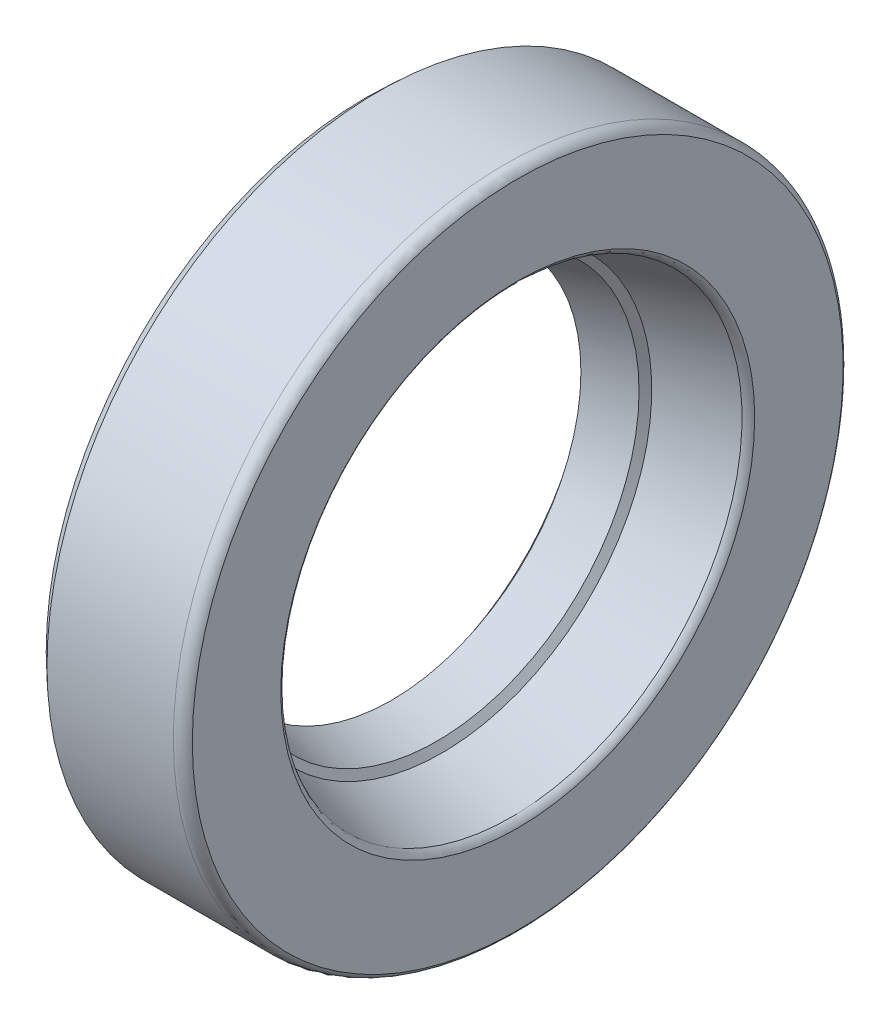
ISO-10303-21;
HEADER;
FILE_DESCRIPTION(('STEP AP214'),'2;1');
FILE_NAME('part.step','',(''),(''),'','','');
FILE_SCHEMA(('AUTOMOTIVE_DESIGN { 1 0 10303 214 1 1 1 1 }'));
ENDSEC;
DATA;
#1=APPLICATION_CONTEXT('core data for automotive mechanical design processes');
#2=APPLICATION_PROTOCOL_DEFINITION('international standard','automotive_design',2000,#1);
#3=PRODUCT_CONTEXT('',#1,'mechanical');
#4=PRODUCT('Part','Part','',(#3));
#5=PRODUCT_RELATED_PRODUCT_CATEGORY('part','',(#4));
#6=PRODUCT_DEFINITION_FORMATION('','',#4);
#7=PRODUCT_DEFINITION_CONTEXT('part definition',#1,'design');
#8=PRODUCT_DEFINITION('design','',#6,#7);
#9=PRODUCT_DEFINITION_SHAPE('','',#8);
#10=(LENGTH_UNIT() NAMED_UNIT(*) SI_UNIT(.MILLI.,.METRE.));
#11=(NAMED_UNIT(*) PLANE_ANGLE_UNIT() SI_UNIT($,.RADIAN.));
#12=(NAMED_UNIT(*) SI_UNIT($,.STERADIAN.) SOLID_ANGLE_UNIT());
#13=UNCERTAINTY_MEASURE_WITH_UNIT(LENGTH_MEASURE(1.E-05),#10,'distance_accuracy_value','');
#14=(GEOMETRIC_REPRESENTATION_CONTEXT(3) GLOBAL_UNCERTAINTY_ASSIGNED_CONTEXT((#13)) GLOBAL_UNIT_ASSIGNED_CONTEXT((#10,
#11,#12)) REPRESENTATION_CONTEXT('',''));
#15=CARTESIAN_POINT('',(0.,0.,0.));
#16=DIRECTION('',(0.,0.,1.));
#17=DIRECTION('',(1.,0.,0.));
#18=AXIS2_PLACEMENT_3D('',#15,#16,#17);
#19=CARTESIAN_POINT('',(0.,0.,0.));
#20=DIRECTION('',(-1.,0.,0.));
#21=DIRECTION('',(0.,0.,1.));
#22=AXIS2_PLACEMENT_3D('',#19,#20,#21);
#23=CYLINDRICAL_SURFACE('',#22,17.5);
#24=CARTESIAN_POINT('',(7.33333333333333,0.,0.));
#25=DIRECTION('',(-1.,0.,0.));
#26=DIRECTION('',(0.,0.,1.));
#27=AXIS2_PLACEMENT_3D('',#24,#25,#26);
#28=CIRCLE('',#27,17.5);
#29=CARTESIAN_POINT('',(7.33333333333333,0.,17.5));
#30=VERTEX_POINT('',#29);
#31=EDGE_CURVE('E10',#30,#30,#28,.T.);
#32=ORIENTED_EDGE('',*,*,#31,.T.);
#33=EDGE_LOOP('',(#32));
#34=FACE_BOUND('',#33,.T.);
#35=CARTESIAN_POINT('',(0.666666666666667,0.,0.));
#36=DIRECTION('',(-1.,0.,0.));
#37=DIRECTION('',(0.,0.,1.));
#38=AXIS2_PLACEMENT_3D('',#35,#36,#37);
#39=CIRCLE('',#38,17.5);
#40=CARTESIAN_POINT('',(0.666666666666667,0.,17.5));
#41=VERTEX_POINT('',#40);
#42=EDGE_CURVE('E70',#41,#41,#39,.T.);
#43=ORIENTED_EDGE('',*,*,#42,.F.);
#44=EDGE_LOOP('',(#43));
#45=FACE_BOUND('',#44,.T.);
#46=ADVANCED_FACE('F15',(#34,#45),#23,.T.);
#47=CARTESIAN_POINT('',(7.41946005043015,0.,0.));
#48=DIRECTION('',(-1.,0.,0.));
#49=DIRECTION('',(0.,0.,1.));
#50=AXIS2_PLACEMENT_3D('',#47,#48,#49);
#51=TOROIDAL_SURFACE('',#50,16.8389201008603,0.666666666666667);
#52=ORIENTED_EDGE('',*,*,#31,.F.);
#53=EDGE_LOOP('',(#52));
#54=FACE_BOUND('',#53,.T.);
#55=CARTESIAN_POINT('',(8.,0.,0.));
#56=DIRECTION('',(-1.,0.,0.));
#57=DIRECTION('',(0.,0.,1.));
#58=AXIS2_PLACEMENT_3D('',#55,#56,#57);
#59=CIRCLE('',#58,17.1666666666667);
#60=CARTESIAN_POINT('',(8.,0.,17.1666666666667));
#61=VERTEX_POINT('',#60);
#62=EDGE_CURVE('E21',#61,#61,#59,.T.);
#63=ORIENTED_EDGE('',*,*,#62,.T.);
#64=EDGE_LOOP('',(#63));
#65=FACE_BOUND('',#64,.T.);
#66=ADVANCED_FACE('F78',(#54,#65),#51,.T.);
#67=CARTESIAN_POINT('',(8.,17.1666666666667,0.));
#68=DIRECTION('',(1.,0.,0.));
#69=DIRECTION('',(0.,0.,-1.));
#70=AXIS2_PLACEMENT_3D('',#67,#68,#69);
#71=PLANE('',#70);
#72=CARTESIAN_POINT('',(8.,0.,0.));
#73=DIRECTION('',(-1.,0.,0.));
#74=DIRECTION('',(0.,0.,1.));
#75=AXIS2_PLACEMENT_3D('',#72,#73,#74);
#76=CIRCLE('',#75,12.5);
#77=CARTESIAN_POINT('',(8.,0.,12.5));
#78=VERTEX_POINT('',#77);
#79=EDGE_CURVE('E25',#78,#78,#76,.T.);
#80=ORIENTED_EDGE('',*,*,#79,.T.);
#81=EDGE_LOOP('',(#80));
#82=FACE_BOUND('',#81,.T.);
#83=ORIENTED_EDGE('',*,*,#62,.F.);
#84=EDGE_LOOP('',(#83));
#85=FACE_BOUND('',#84,.T.);
#86=ADVANCED_FACE('F83',(#82,#85),#71,.T.);
#87=CARTESIAN_POINT('',(7.39237478148924,0.,0.));
#88=DIRECTION('',(-1.,0.,0.));
#89=DIRECTION('',(0.,0.,1.));
#90=AXIS2_PLACEMENT_3D('',#87,#88,#89);
#91=TOROIDAL_SURFACE('',#90,12.7742918851774,0.666666666666667);
#92=ORIENTED_EDGE('',*,*,#79,.F.);
#93=EDGE_LOOP('',(#92));
#94=FACE_BOUND('',#93,.T.);
#95=CARTESIAN_POINT('',(7.66666666666667,0.,0.));
#96=DIRECTION('',(-1.,0.,0.));
#97=DIRECTION('',(0.,0.,1.));
#98=AXIS2_PLACEMENT_3D('',#95,#96,#97);
#99=CIRCLE('',#98,12.1666666666667);
#100=CARTESIAN_POINT('',(7.66666666666667,0.,12.1666666666667));
#101=VERTEX_POINT('',#100);
#102=EDGE_CURVE('E29',#101,#101,#99,.T.);
#103=ORIENTED_EDGE('',*,*,#102,.T.);
#104=EDGE_LOOP('',(#103));
#105=FACE_BOUND('',#104,.T.);
#106=ADVANCED_FACE('F88',(#94,#105),#91,.T.);
#107=CARTESIAN_POINT('',(7.66666666666667,0.,0.));
#108=DIRECTION('',(1.,0.,0.));
#109=DIRECTION('',(0.,0.,-1.));
#110=AXIS2_PLACEMENT_3D('',#107,#108,#109);
#111=CONICAL_SURFACE('',#110,12.1666666666667,0.290264899929044);
#112=CARTESIAN_POINT('',(4.,0.,0.));
#113=DIRECTION('',(-1.,0.,0.));
#114=DIRECTION('',(0.,0.,1.));
#115=AXIS2_PLACEMENT_3D('',#112,#113,#114);
#116=CIRCLE('',#115,11.0714285714286);
#117=CARTESIAN_POINT('',(4.,0.,11.0714285714286));
#118=VERTEX_POINT('',#117);
#119=EDGE_CURVE('E34',#118,#118,#116,.T.);
#120=ORIENTED_EDGE('',*,*,#119,.T.);
#121=EDGE_LOOP('',(#120));
#122=FACE_BOUND('',#121,.T.);
#123=ORIENTED_EDGE('',*,*,#102,.F.);
#124=EDGE_LOOP('',(#123));
#125=FACE_BOUND('',#124,.T.);
#126=ADVANCED_FACE('F94',(#122,#125),#111,.F.);
#127=CARTESIAN_POINT('',(4.,0.,0.));
#128=DIRECTION('',(1.,0.,0.));
#129=DIRECTION('',(0.,0.,-1.));
#130=AXIS2_PLACEMENT_3D('',#127,#128,#129);
#131=CONICAL_SURFACE('',#130,11.0714285714286,0.988243260581542);
#132=CARTESIAN_POINT('',(3.73333333333334,0.,0.));
#133=DIRECTION('',(-1.,0.,0.));
#134=DIRECTION('',(0.,0.,1.));
#135=AXIS2_PLACEMENT_3D('',#132,#133,#134);
#136=CIRCLE('',#135,10.6666666666667);
#137=CARTESIAN_POINT('',(3.73333333333334,0.,10.6666666666667));
#138=VERTEX_POINT('',#137);
#139=EDGE_CURVE('E37',#138,#138,#136,.T.);
#140=ORIENTED_EDGE('',*,*,#139,.T.);
#141=EDGE_LOOP('',(#140));
#142=FACE_BOUND('',#141,.T.);
#143=ORIENTED_EDGE('',*,*,#119,.F.);
#144=EDGE_LOOP('',(#143));
#145=FACE_BOUND('',#144,.T.);
#146=ADVANCED_FACE('F98',(#142,#145),#131,.F.);
#147=CARTESIAN_POINT('',(3.73333333333334,0.,0.));
#148=DIRECTION('',(1.,0.,0.));
#149=DIRECTION('',(0.,0.,-1.));
#150=AXIS2_PLACEMENT_3D('',#147,#148,#149);
#151=CONICAL_SURFACE('',#150,10.6666666666667,0.27094685033842);
#152=CARTESIAN_POINT('',(1.33333333333333,0.,0.));
#153=DIRECTION('',(-1.,0.,0.));
#154=DIRECTION('',(0.,0.,1.));
#155=AXIS2_PLACEMENT_3D('',#152,#153,#154);
#156=CIRCLE('',#155,10.);
#157=CARTESIAN_POINT('',(1.33333333333333,0.,10.));
#158=VERTEX_POINT('',#157);
#159=EDGE_CURVE('E40',#158,#158,#156,.T.);
#160=ORIENTED_EDGE('',*,*,#159,.T.);
#161=EDGE_LOOP('',(#160));
#162=FACE_BOUND('',#161,.T.);
#163=ORIENTED_EDGE('',*,*,#139,.F.);
#164=EDGE_LOOP('',(#163));
#165=FACE_BOUND('',#164,.T.);
#166=ADVANCED_FACE('F102',(#162,#165),#151,.F.);
#167=CARTESIAN_POINT('',(1.33333333333333,0.,0.));
#168=DIRECTION('',(-1.,0.,0.));
#169=DIRECTION('',(0.,0.,1.));
#170=AXIS2_PLACEMENT_3D('',#167,#168,#169);
#171=CONICAL_SURFACE('',#170,10.,0.929431966886443);
#172=CARTESIAN_POINT('',(0.533333333333334,0.,0.));
#173=DIRECTION('',(-1.,0.,0.));
#174=DIRECTION('',(0.,0.,1.));
#175=AXIS2_PLACEMENT_3D('',#172,#173,#174);
#176=CIRCLE('',#175,11.0714285714286);
#177=CARTESIAN_POINT('',(0.533333333333334,0.,11.0714285714286));
#178=VERTEX_POINT('',#177);
#179=EDGE_CURVE('E43',#178,#178,#176,.T.);
#180=ORIENTED_EDGE('',*,*,#179,.T.);
#181=EDGE_LOOP('',(#180));
#182=FACE_BOUND('',#181,.T.);
#183=ORIENTED_EDGE('',*,*,#159,.F.);
#184=EDGE_LOOP('',(#183));
#185=FACE_BOUND('',#184,.T.);
#186=ADVANCED_FACE('F106',(#182,#185),#171,.F.);
#187=CARTESIAN_POINT('',(0.533333333333333,11.0714285714286,0.));
#188=DIRECTION('',(-1.,0.,0.));
#189=DIRECTION('',(0.,0.,1.));
#190=AXIS2_PLACEMENT_3D('',#187,#188,#189);
#191=PLANE('',#190);
#192=CARTESIAN_POINT('',(0.533333333333334,0.,0.));
#193=DIRECTION('',(-1.,0.,0.));
#194=DIRECTION('',(0.,0.,1.));
#195=AXIS2_PLACEMENT_3D('',#192,#193,#194);
#196=CIRCLE('',#195,12.7464212528967);
#197=CARTESIAN_POINT('',(0.533333333333334,0.,12.7464212528967));
#198=VERTEX_POINT('',#197);
#199=EDGE_CURVE('E46',#198,#198,#196,.T.);
#200=ORIENTED_EDGE('',*,*,#199,.T.);
#201=EDGE_LOOP('',(#200));
#202=FACE_BOUND('',#201,.T.);
#203=ORIENTED_EDGE('',*,*,#179,.F.);
#204=EDGE_LOOP('',(#203));
#205=FACE_BOUND('',#204,.T.);
#206=ADVANCED_FACE('F110',(#202,#205),#191,.T.);
#207=CARTESIAN_POINT('',(0.,0.,0.));
#208=DIRECTION('',(-1.,0.,0.));
#209=DIRECTION('',(0.,0.,1.));
#210=AXIS2_PLACEMENT_3D('',#207,#208,#209);
#211=CYLINDRICAL_SURFACE('',#210,12.7464212528967);
#212=CARTESIAN_POINT('',(1.57795142459664,0.,0.));
#213=DIRECTION('',(-1.,0.,0.));
#214=DIRECTION('',(0.,0.,1.));
#215=AXIS2_PLACEMENT_3D('',#212,#213,#214);
#216=CIRCLE('',#215,12.7464212528967);
#217=CARTESIAN_POINT('',(1.57795142459664,0.,12.7464212528967));
#218=VERTEX_POINT('',#217);
#219=EDGE_CURVE('E49',#218,#218,#216,.T.);
#220=ORIENTED_EDGE('',*,*,#219,.T.);
#221=EDGE_LOOP('',(#220));
#222=FACE_BOUND('',#221,.T.);
#223=ORIENTED_EDGE('',*,*,#199,.F.);
#224=EDGE_LOOP('',(#223));
#225=FACE_BOUND('',#224,.T.);
#226=ADVANCED_FACE('F114',(#222,#225),#211,.T.);
#227=CARTESIAN_POINT('',(2.,0.,0.));
#228=DIRECTION('',(-1.,0.,0.));
#229=DIRECTION('',(0.,0.,1.));
#230=AXIS2_PLACEMENT_3D('',#227,#228,#229);
#231=TOROIDAL_SURFACE('',#230,11.875,0.968245836551854);
#232=ORIENTED_EDGE('',*,*,#219,.F.);
#233=EDGE_LOOP('',(#232));
#234=FACE_BOUND('',#233,.T.);
#235=CARTESIAN_POINT('',(2.9449901071866,0.,0.));
#236=DIRECTION('',(-1.,0.,0.));
#237=DIRECTION('',(0.,0.,1.));
#238=AXIS2_PLACEMENT_3D('',#235,#236,#237);
#239=CIRCLE('',#238,12.0859352917827);
#240=CARTESIAN_POINT('',(2.9449901071866,0.,12.0859352917827));
#241=VERTEX_POINT('',#240);
#242=EDGE_CURVE('E52',#241,#241,#239,.T.);
#243=ORIENTED_EDGE('',*,*,#242,.T.);
#244=EDGE_LOOP('',(#243));
#245=FACE_BOUND('',#244,.T.);
#246=ADVANCED_FACE('F118',(#234,#245),#231,.T.);
#247=CARTESIAN_POINT('',(4.8,0.,0.));
#248=DIRECTION('',(1.,0.,0.));
#249=DIRECTION('',(0.,0.,-1.));
#250=AXIS2_PLACEMENT_3D('',#247,#248,#249);
#251=CONICAL_SURFACE('',#250,12.5,0.2196141251766);
#252=ORIENTED_EDGE('',*,*,#242,.F.);
#253=EDGE_LOOP('',(#252));
#254=FACE_BOUND('',#253,.T.);
#255=CARTESIAN_POINT('',(4.8,0.,0.));
#256=DIRECTION('',(-1.,0.,0.));
#257=DIRECTION('',(0.,0.,1.));
#258=AXIS2_PLACEMENT_3D('',#255,#256,#257);
#259=CIRCLE('',#258,12.5);
#260=CARTESIAN_POINT('',(4.8,0.,12.5));
#261=VERTEX_POINT('',#260);
#262=EDGE_CURVE('E55',#261,#261,#259,.T.);
#263=ORIENTED_EDGE('',*,*,#262,.T.);
#264=EDGE_LOOP('',(#263));
#265=FACE_BOUND('',#264,.T.);
#266=ADVANCED_FACE('F122',(#254,#265),#251,.T.);
#267=CARTESIAN_POINT('',(4.8,15.2916666666667,0.));
#268=DIRECTION('',(1.,0.,0.));
#269=DIRECTION('',(0.,0.,-1.));
#270=AXIS2_PLACEMENT_3D('',#267,#268,#269);
#271=PLANE('',#270);
#272=ORIENTED_EDGE('',*,*,#262,.F.);
#273=EDGE_LOOP('',(#272));
#274=FACE_BOUND('',#273,.T.);
#275=CARTESIAN_POINT('',(4.8,0.,0.));
#276=DIRECTION('',(-1.,0.,0.));
#277=DIRECTION('',(0.,0.,1.));
#278=AXIS2_PLACEMENT_3D('',#275,#276,#277);
#279=CIRCLE('',#278,15.2916666666667);
#280=CARTESIAN_POINT('',(4.8,0.,15.2916666666667));
#281=VERTEX_POINT('',#280);
#282=EDGE_CURVE('E58',#281,#281,#279,.T.);
#283=ORIENTED_EDGE('',*,*,#282,.T.);
#284=EDGE_LOOP('',(#283));
#285=FACE_BOUND('',#284,.T.);
#286=ADVANCED_FACE('F126',(#274,#285),#271,.F.);
#287=CARTESIAN_POINT('',(4.19237478148924,0.,0.));
#288=DIRECTION('',(-1.,0.,0.));
#289=DIRECTION('',(0.,0.,1.));
#290=AXIS2_PLACEMENT_3D('',#287,#288,#289);
#291=TOROIDAL_SURFACE('',#290,15.0173747814893,0.666666666666667);
#292=CARTESIAN_POINT('',(4.46666666666667,0.,0.));
#293=DIRECTION('',(-1.,0.,0.));
#294=DIRECTION('',(0.,0.,1.));
#295=AXIS2_PLACEMENT_3D('',#292,#293,#294);
#296=CIRCLE('',#295,15.625);
#297=CARTESIAN_POINT('',(4.46666666666667,0.,15.625));
#298=VERTEX_POINT('',#297);
#299=EDGE_CURVE('E61',#298,#298,#296,.T.);
#300=ORIENTED_EDGE('',*,*,#299,.T.);
#301=EDGE_LOOP('',(#300));
#302=FACE_BOUND('',#301,.T.);
#303=ORIENTED_EDGE('',*,*,#282,.F.);
#304=EDGE_LOOP('',(#303));
#305=FACE_BOUND('',#304,.T.);
#306=ADVANCED_FACE('F130',(#302,#305),#291,.F.);
#307=CARTESIAN_POINT('',(0.,0.,0.));
#308=DIRECTION('',(-1.,0.,0.));
#309=DIRECTION('',(0.,0.,1.));
#310=AXIS2_PLACEMENT_3D('',#307,#308,#309);
#311=CONICAL_SURFACE('',#310,16.,0.0837588016725198);
#312=ORIENTED_EDGE('',*,*,#299,.F.);
#313=EDGE_LOOP('',(#312));
#314=FACE_BOUND('',#313,.T.);
#315=CARTESIAN_POINT('',(0.,0.,0.));
#316=DIRECTION('',(-1.,0.,0.));
#317=DIRECTION('',(0.,0.,1.));
#318=AXIS2_PLACEMENT_3D('',#315,#316,#317);
#319=CIRCLE('',#318,16.);
#320=CARTESIAN_POINT('',(0.,0.,16.));
#321=VERTEX_POINT('',#320);
#322=EDGE_CURVE('E64',#321,#321,#319,.T.);
#323=ORIENTED_EDGE('',*,*,#322,.T.);
#324=EDGE_LOOP('',(#323));
#325=FACE_BOUND('',#324,.T.);
#326=ADVANCED_FACE('F134',(#314,#325),#311,.F.);
#327=CARTESIAN_POINT('',(0.,16.,0.));
#328=DIRECTION('',(-1.,0.,0.));
#329=DIRECTION('',(0.,0.,1.));
#330=AXIS2_PLACEMENT_3D('',#327,#328,#329);
#331=PLANE('',#330);
#332=CARTESIAN_POINT('',(0.,0.,0.));
#333=DIRECTION('',(-1.,0.,0.));
#334=DIRECTION('',(0.,0.,1.));
#335=AXIS2_PLACEMENT_3D('',#332,#333,#334);
#336=CIRCLE('',#335,16.875);
#337=CARTESIAN_POINT('',(0.,0.,16.875));
#338=VERTEX_POINT('',#337);
#339=EDGE_CURVE('E67',#338,#338,#336,.T.);
#340=ORIENTED_EDGE('',*,*,#339,.T.);
#341=EDGE_LOOP('',(#340));
#342=FACE_BOUND('',#341,.T.);
#343=ORIENTED_EDGE('',*,*,#322,.F.);
#344=EDGE_LOOP('',(#343));
#345=FACE_BOUND('',#344,.T.);
#346=ADVANCED_FACE('F138',(#342,#345),#331,.T.);
#347=CARTESIAN_POINT('',(0.,0.,0.));
#348=DIRECTION('',(1.,0.,0.));
#349=DIRECTION('',(0.,0.,-1.));
#350=AXIS2_PLACEMENT_3D('',#347,#348,#349);
#351=CONICAL_SURFACE('',#350,16.875,0.753151280962195);
#352=ORIENTED_EDGE('',*,*,#42,.T.);
#353=EDGE_LOOP('',(#352));
#354=FACE_BOUND('',#353,.T.);
#355=ORIENTED_EDGE('',*,*,#339,.F.);
#356=EDGE_LOOP('',(#355));
#357=FACE_BOUND('',#356,.T.);
#358=ADVANCED_FACE('F74',(#354,#357),#351,.T.);
#359=CLOSED_SHELL('',(#46,#66,#86,#106,#126,#146,#166,#186,#206,#226,#246,#266,#286,#306,#326,
#346,#358));
#360=MANIFOLD_SOLID_BREP('B1',#359);
#361=ADVANCED_BREP_SHAPE_REPRESENTATION('',(#18,#360),#14);
#362=SHAPE_DEFINITION_REPRESENTATION(#9,#361);
ENDSEC;
END-ISO-10303-21;
